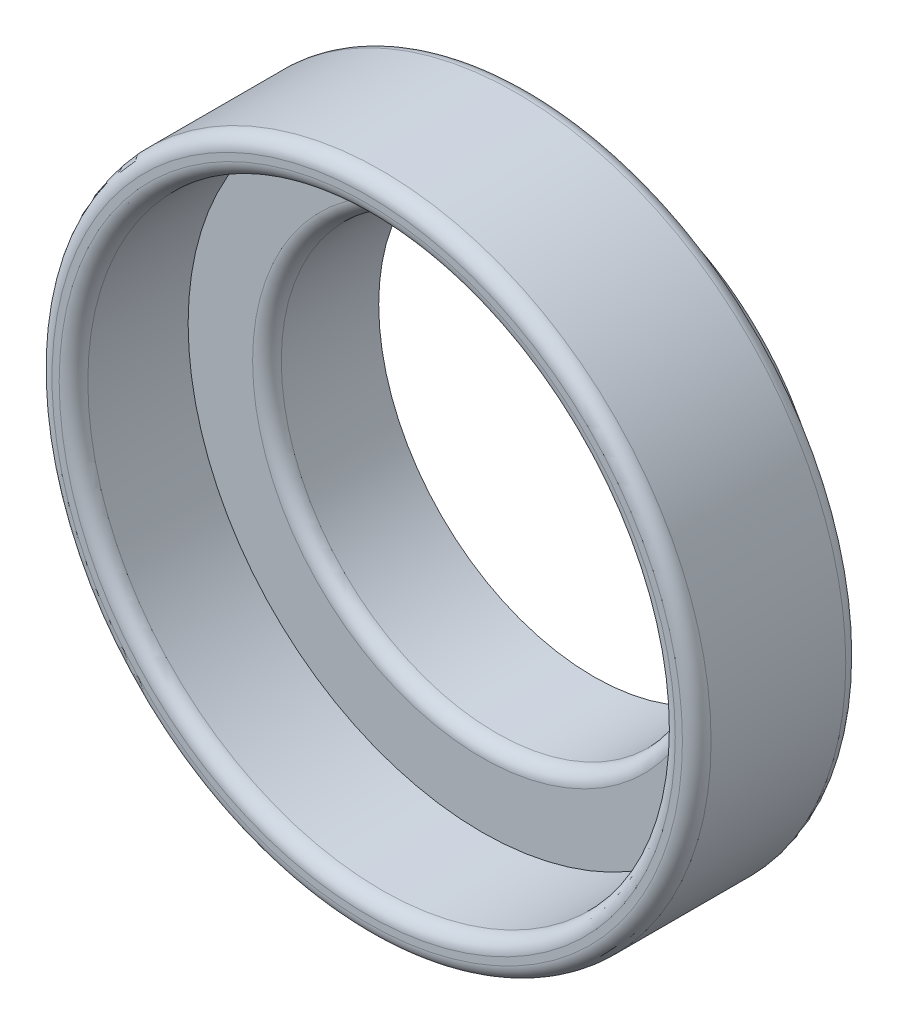
ISO-10303-21;
HEADER;
FILE_DESCRIPTION(('STEP AP214'),'2;1');
FILE_NAME('part.step','',(''),(''),'','','');
FILE_SCHEMA(('AUTOMOTIVE_DESIGN { 1 0 10303 214 1 1 1 1 }'));
ENDSEC;
DATA;
#1=APPLICATION_CONTEXT('core data for automotive mechanical design processes');
#2=APPLICATION_PROTOCOL_DEFINITION('international standard','automotive_design',2000,#1);
#3=PRODUCT_CONTEXT('',#1,'mechanical');
#4=PRODUCT('Part','Part','',(#3));
#5=PRODUCT_RELATED_PRODUCT_CATEGORY('part','',(#4));
#6=PRODUCT_DEFINITION_FORMATION('','',#4);
#7=PRODUCT_DEFINITION_CONTEXT('part definition',#1,'design');
#8=PRODUCT_DEFINITION('design','',#6,#7);
#9=PRODUCT_DEFINITION_SHAPE('','',#8);
#10=(LENGTH_UNIT() NAMED_UNIT(*) SI_UNIT(.MILLI.,.METRE.));
#11=(NAMED_UNIT(*) PLANE_ANGLE_UNIT() SI_UNIT($,.RADIAN.));
#12=(NAMED_UNIT(*) SI_UNIT($,.STERADIAN.) SOLID_ANGLE_UNIT());
#13=UNCERTAINTY_MEASURE_WITH_UNIT(LENGTH_MEASURE(1.E-05),#10,'distance_accuracy_value','');
#14=(GEOMETRIC_REPRESENTATION_CONTEXT(3) GLOBAL_UNCERTAINTY_ASSIGNED_CONTEXT((#13)) GLOBAL_UNIT_ASSIGNED_CONTEXT((#10,
#11,#12)) REPRESENTATION_CONTEXT('',''));
#15=CARTESIAN_POINT('',(0.,0.,0.));
#16=DIRECTION('',(0.,0.,1.));
#17=DIRECTION('',(1.,0.,0.));
#18=AXIS2_PLACEMENT_3D('',#15,#16,#17);
#19=CARTESIAN_POINT('',(0.,0.,11.4));
#20=DIRECTION('',(0.,0.,-1.));
#21=DIRECTION('',(-1.,0.,0.));
#22=AXIS2_PLACEMENT_3D('',#19,#20,#21);
#23=CYLINDRICAL_SURFACE('',#22,23.);
#24=CARTESIAN_POINT('',(0.,0.,1.));
#25=DIRECTION('',(0.,0.,1.));
#26=DIRECTION('',(1.,0.,0.));
#27=AXIS2_PLACEMENT_3D('',#24,#25,#26);
#28=CIRCLE('',#27,23.);
#29=CARTESIAN_POINT('',(23.,0.,1.));
#30=VERTEX_POINT('',#29);
#31=EDGE_CURVE('E49',#30,#30,#28,.T.);
#32=ORIENTED_EDGE('',*,*,#31,.T.);
#33=EDGE_LOOP('',(#32));
#34=FACE_BOUND('',#33,.T.);
#35=CARTESIAN_POINT('',(0.,0.,10.4));
#36=DIRECTION('',(0.,0.,1.));
#37=DIRECTION('',(1.,0.,0.));
#38=AXIS2_PLACEMENT_3D('',#35,#36,#37);
#39=CIRCLE('',#38,23.);
#40=CARTESIAN_POINT('',(23.,0.,10.4));
#41=VERTEX_POINT('',#40);
#42=EDGE_CURVE('E65',#41,#41,#39,.F.);
#43=ORIENTED_EDGE('',*,*,#42,.T.);
#44=EDGE_LOOP('',(#43));
#45=FACE_BOUND('',#44,.T.);
#46=ADVANCED_FACE('F41',(#34,#45),#23,.T.);
#47=CARTESIAN_POINT('',(0.,0.,11.4));
#48=DIRECTION('',(0.,0.,1.));
#49=DIRECTION('',(1.,0.,0.));
#50=AXIS2_PLACEMENT_3D('',#47,#48,#49);
#51=PLANE('',#50);
#52=CARTESIAN_POINT('',(0.,0.,11.4));
#53=DIRECTION('',(0.,0.,1.));
#54=DIRECTION('',(1.,0.,0.));
#55=AXIS2_PLACEMENT_3D('',#52,#53,#54);
#56=CIRCLE('',#55,21.5);
#57=CARTESIAN_POINT('',(21.5,0.,11.4));
#58=VERTEX_POINT('',#57);
#59=EDGE_CURVE('E69',#58,#58,#56,.F.);
#60=ORIENTED_EDGE('',*,*,#59,.T.);
#61=EDGE_LOOP('',(#60));
#62=FACE_BOUND('',#61,.T.);
#63=CARTESIAN_POINT('',(0.,0.,11.4));
#64=DIRECTION('',(0.,0.,1.));
#65=DIRECTION('',(1.,0.,0.));
#66=AXIS2_PLACEMENT_3D('',#63,#64,#65);
#67=CIRCLE('',#66,22.);
#68=CARTESIAN_POINT('',(22.,0.,11.4));
#69=VERTEX_POINT('',#68);
#70=EDGE_CURVE('E73',#69,#69,#67,.T.);
#71=ORIENTED_EDGE('',*,*,#70,.T.);
#72=EDGE_LOOP('',(#71));
#73=FACE_BOUND('',#72,.T.);
#74=ADVANCED_FACE('F120',(#62,#73),#51,.T.);
#75=CARTESIAN_POINT('',(0.,0.,0.));
#76=DIRECTION('',(0.,0.,1.));
#77=DIRECTION('',(1.,0.,0.));
#78=AXIS2_PLACEMENT_3D('',#75,#76,#77);
#79=PLANE('',#78);
#80=CARTESIAN_POINT('',(0.,0.,0.));
#81=DIRECTION('',(0.,0.,1.));
#82=DIRECTION('',(1.,0.,0.));
#83=AXIS2_PLACEMENT_3D('',#80,#81,#82);
#84=CIRCLE('',#83,22.);
#85=CARTESIAN_POINT('',(22.,0.,0.));
#86=VERTEX_POINT('',#85);
#87=EDGE_CURVE('E10',#86,#86,#84,.F.);
#88=ORIENTED_EDGE('',*,*,#87,.T.);
#89=EDGE_LOOP('',(#88));
#90=FACE_BOUND('',#89,.T.);
#91=CARTESIAN_POINT('',(0.,0.,0.));
#92=DIRECTION('',(0.,0.,1.));
#93=DIRECTION('',(1.,0.,0.));
#94=AXIS2_PLACEMENT_3D('',#91,#92,#93);
#95=CIRCLE('',#94,16.99);
#96=CARTESIAN_POINT('',(16.99,0.,0.));
#97=VERTEX_POINT('',#96);
#98=EDGE_CURVE('E90',#97,#97,#95,.T.);
#99=ORIENTED_EDGE('',*,*,#98,.T.);
#100=EDGE_LOOP('',(#99));
#101=FACE_BOUND('',#100,.T.);
#102=ADVANCED_FACE('F125',(#90,#101),#79,.F.);
#103=CARTESIAN_POINT('',(0.,0.,3.4));
#104=DIRECTION('',(0.,0.,1.));
#105=DIRECTION('',(1.,0.,0.));
#106=AXIS2_PLACEMENT_3D('',#103,#104,#105);
#107=CYLINDRICAL_SURFACE('',#106,20.5);
#108=CARTESIAN_POINT('',(0.,0.,10.4));
#109=DIRECTION('',(0.,0.,1.));
#110=DIRECTION('',(1.,0.,0.));
#111=AXIS2_PLACEMENT_3D('',#108,#109,#110);
#112=CIRCLE('',#111,20.5);
#113=CARTESIAN_POINT('',(20.5,0.,10.4));
#114=VERTEX_POINT('',#113);
#115=EDGE_CURVE('E77',#114,#114,#112,.T.);
#116=ORIENTED_EDGE('',*,*,#115,.T.);
#117=EDGE_LOOP('',(#116));
#118=FACE_BOUND('',#117,.T.);
#119=CARTESIAN_POINT('',(0.,0.,3.4));
#120=DIRECTION('',(0.,0.,1.));
#121=DIRECTION('',(1.,0.,0.));
#122=AXIS2_PLACEMENT_3D('',#119,#120,#121);
#123=CIRCLE('',#122,20.5);
#124=CARTESIAN_POINT('',(20.5,0.,3.4));
#125=VERTEX_POINT('',#124);
#126=EDGE_CURVE('E89',#125,#125,#123,.T.);
#127=ORIENTED_EDGE('',*,*,#126,.F.);
#128=EDGE_LOOP('',(#127));
#129=FACE_BOUND('',#128,.T.);
#130=ADVANCED_FACE('F155',(#118,#129),#107,.F.);
#131=CARTESIAN_POINT('',(0.,0.,3.4));
#132=DIRECTION('',(0.,0.,1.));
#133=DIRECTION('',(1.,0.,0.));
#134=AXIS2_PLACEMENT_3D('',#131,#132,#133);
#135=PLANE('',#134);
#136=CARTESIAN_POINT('',(0.,0.,3.4));
#137=DIRECTION('',(0.,0.,1.));
#138=DIRECTION('',(1.,0.,0.));
#139=AXIS2_PLACEMENT_3D('',#136,#137,#138);
#140=CIRCLE('',#139,16.);
#141=CARTESIAN_POINT('',(16.,0.,3.4));
#142=VERTEX_POINT('',#141);
#143=EDGE_CURVE('E81',#142,#142,#140,.F.);
#144=ORIENTED_EDGE('',*,*,#143,.T.);
#145=EDGE_LOOP('',(#144));
#146=FACE_BOUND('',#145,.T.);
#147=ORIENTED_EDGE('',*,*,#126,.T.);
#148=EDGE_LOOP('',(#147));
#149=FACE_BOUND('',#148,.T.);
#150=ADVANCED_FACE('F150',(#146,#149),#135,.T.);
#151=CARTESIAN_POINT('',(0.,0.,-4.4));
#152=DIRECTION('',(0.,0.,1.));
#153=DIRECTION('',(1.,0.,0.));
#154=AXIS2_PLACEMENT_3D('',#151,#152,#153);
#155=CYLINDRICAL_SURFACE('',#154,16.99);
#156=CARTESIAN_POINT('',(0.,0.,-3.4));
#157=DIRECTION('',(0.,0.,1.));
#158=DIRECTION('',(1.,0.,0.));
#159=AXIS2_PLACEMENT_3D('',#156,#157,#158);
#160=CIRCLE('',#159,16.99);
#161=CARTESIAN_POINT('',(16.99,0.,-3.4));
#162=VERTEX_POINT('',#161);
#163=EDGE_CURVE('E59',#162,#162,#160,.T.);
#164=ORIENTED_EDGE('',*,*,#163,.T.);
#165=EDGE_LOOP('',(#164));
#166=FACE_BOUND('',#165,.T.);
#167=ORIENTED_EDGE('',*,*,#98,.F.);
#168=EDGE_LOOP('',(#167));
#169=FACE_BOUND('',#168,.T.);
#170=ADVANCED_FACE('F116',(#166,#169),#155,.T.);
#171=CARTESIAN_POINT('',(0.,0.,-4.4));
#172=DIRECTION('',(0.,0.,1.));
#173=DIRECTION('',(1.,0.,0.));
#174=AXIS2_PLACEMENT_3D('',#171,#172,#173);
#175=PLANE('',#174);
#176=CARTESIAN_POINT('',(0.,0.,-4.4));
#177=DIRECTION('',(0.,0.,1.));
#178=DIRECTION('',(1.,0.,0.));
#179=AXIS2_PLACEMENT_3D('',#176,#177,#178);
#180=CIRCLE('',#179,15.99);
#181=CARTESIAN_POINT('',(15.99,0.,-4.4));
#182=VERTEX_POINT('',#181);
#183=EDGE_CURVE('E54',#182,#182,#180,.F.);
#184=ORIENTED_EDGE('',*,*,#183,.T.);
#185=EDGE_LOOP('',(#184));
#186=FACE_BOUND('',#185,.T.);
#187=CARTESIAN_POINT('',(0.,0.,-4.4));
#188=DIRECTION('',(0.,0.,1.));
#189=DIRECTION('',(1.,0.,0.));
#190=AXIS2_PLACEMENT_3D('',#187,#188,#189);
#191=CIRCLE('',#190,15.);
#192=CARTESIAN_POINT('',(15.,0.,-4.4));
#193=VERTEX_POINT('',#192);
#194=EDGE_CURVE('E94',#193,#193,#191,.T.);
#195=ORIENTED_EDGE('',*,*,#194,.T.);
#196=EDGE_LOOP('',(#195));
#197=FACE_BOUND('',#196,.T.);
#198=ADVANCED_FACE('F102',(#186,#197),#175,.F.);
#199=CARTESIAN_POINT('',(0.,0.,-4.4));
#200=DIRECTION('',(0.,0.,1.));
#201=DIRECTION('',(1.,0.,0.));
#202=AXIS2_PLACEMENT_3D('',#199,#200,#201);
#203=CYLINDRICAL_SURFACE('',#202,15.);
#204=CARTESIAN_POINT('',(0.,0.,2.4));
#205=DIRECTION('',(0.,0.,1.));
#206=DIRECTION('',(1.,0.,0.));
#207=AXIS2_PLACEMENT_3D('',#204,#205,#206);
#208=CIRCLE('',#207,15.);
#209=CARTESIAN_POINT('',(15.,0.,2.4));
#210=VERTEX_POINT('',#209);
#211=EDGE_CURVE('E85',#210,#210,#208,.T.);
#212=ORIENTED_EDGE('',*,*,#211,.T.);
#213=EDGE_LOOP('',(#212));
#214=FACE_BOUND('',#213,.T.);
#215=ORIENTED_EDGE('',*,*,#194,.F.);
#216=EDGE_LOOP('',(#215));
#217=FACE_BOUND('',#216,.T.);
#218=ADVANCED_FACE('F104',(#214,#217),#203,.F.);
#219=CARTESIAN_POINT('',(0.,0.,2.4));
#220=DIRECTION('',(0.,0.,1.));
#221=DIRECTION('',(1.,0.,0.));
#222=AXIS2_PLACEMENT_3D('',#219,#220,#221);
#223=TOROIDAL_SURFACE('',#222,16.,1.);
#224=ORIENTED_EDGE('',*,*,#143,.F.);
#225=EDGE_LOOP('',(#224));
#226=FACE_BOUND('',#225,.T.);
#227=ORIENTED_EDGE('',*,*,#211,.F.);
#228=EDGE_LOOP('',(#227));
#229=FACE_BOUND('',#228,.T.);
#230=ADVANCED_FACE('F106',(#226,#229),#223,.T.);
#231=CARTESIAN_POINT('',(0.,0.,10.4));
#232=DIRECTION('',(0.,0.,1.));
#233=DIRECTION('',(1.,0.,0.));
#234=AXIS2_PLACEMENT_3D('',#231,#232,#233);
#235=TOROIDAL_SURFACE('',#234,21.5,1.);
#236=ORIENTED_EDGE('',*,*,#59,.F.);
#237=EDGE_LOOP('',(#236));
#238=FACE_BOUND('',#237,.T.);
#239=ORIENTED_EDGE('',*,*,#115,.F.);
#240=EDGE_LOOP('',(#239));
#241=FACE_BOUND('',#240,.T.);
#242=ADVANCED_FACE('F113',(#238,#241),#235,.T.);
#243=CARTESIAN_POINT('',(0.,0.,10.4));
#244=DIRECTION('',(0.,0.,1.));
#245=DIRECTION('',(1.,0.,0.));
#246=AXIS2_PLACEMENT_3D('',#243,#244,#245);
#247=TOROIDAL_SURFACE('',#246,22.,1.);
#248=ORIENTED_EDGE('',*,*,#42,.F.);
#249=EDGE_LOOP('',(#248));
#250=FACE_BOUND('',#249,.T.);
#251=ORIENTED_EDGE('',*,*,#70,.F.);
#252=EDGE_LOOP('',(#251));
#253=FACE_BOUND('',#252,.T.);
#254=ADVANCED_FACE('F133',(#250,#253),#247,.T.);
#255=CARTESIAN_POINT('',(0.,0.,-3.4));
#256=DIRECTION('',(0.,0.,1.));
#257=DIRECTION('',(1.,0.,0.));
#258=AXIS2_PLACEMENT_3D('',#255,#256,#257);
#259=TOROIDAL_SURFACE('',#258,15.99,1.);
#260=ORIENTED_EDGE('',*,*,#183,.F.);
#261=EDGE_LOOP('',(#260));
#262=FACE_BOUND('',#261,.T.);
#263=ORIENTED_EDGE('',*,*,#163,.F.);
#264=EDGE_LOOP('',(#263));
#265=FACE_BOUND('',#264,.T.);
#266=ADVANCED_FACE('F136',(#262,#265),#259,.T.);
#267=CARTESIAN_POINT('',(0.,0.,1.));
#268=DIRECTION('',(0.,0.,1.));
#269=DIRECTION('',(1.,0.,0.));
#270=AXIS2_PLACEMENT_3D('',#267,#268,#269);
#271=TOROIDAL_SURFACE('',#270,22.,1.);
#272=ORIENTED_EDGE('',*,*,#87,.F.);
#273=EDGE_LOOP('',(#272));
#274=FACE_BOUND('',#273,.T.);
#275=ORIENTED_EDGE('',*,*,#31,.F.);
#276=EDGE_LOOP('',(#275));
#277=FACE_BOUND('',#276,.T.);
#278=ADVANCED_FACE('F43',(#274,#277),#271,.T.);
#279=CLOSED_SHELL('',(#46,#74,#102,#130,#150,#170,#198,#218,#230,#242,#254,#266,#278));
#280=MANIFOLD_SOLID_BREP('B2',#279);
#281=ADVANCED_BREP_SHAPE_REPRESENTATION('',(#18,#280),#14);
#282=SHAPE_DEFINITION_REPRESENTATION(#9,#281);
ENDSEC;
END-ISO-10303-21;
